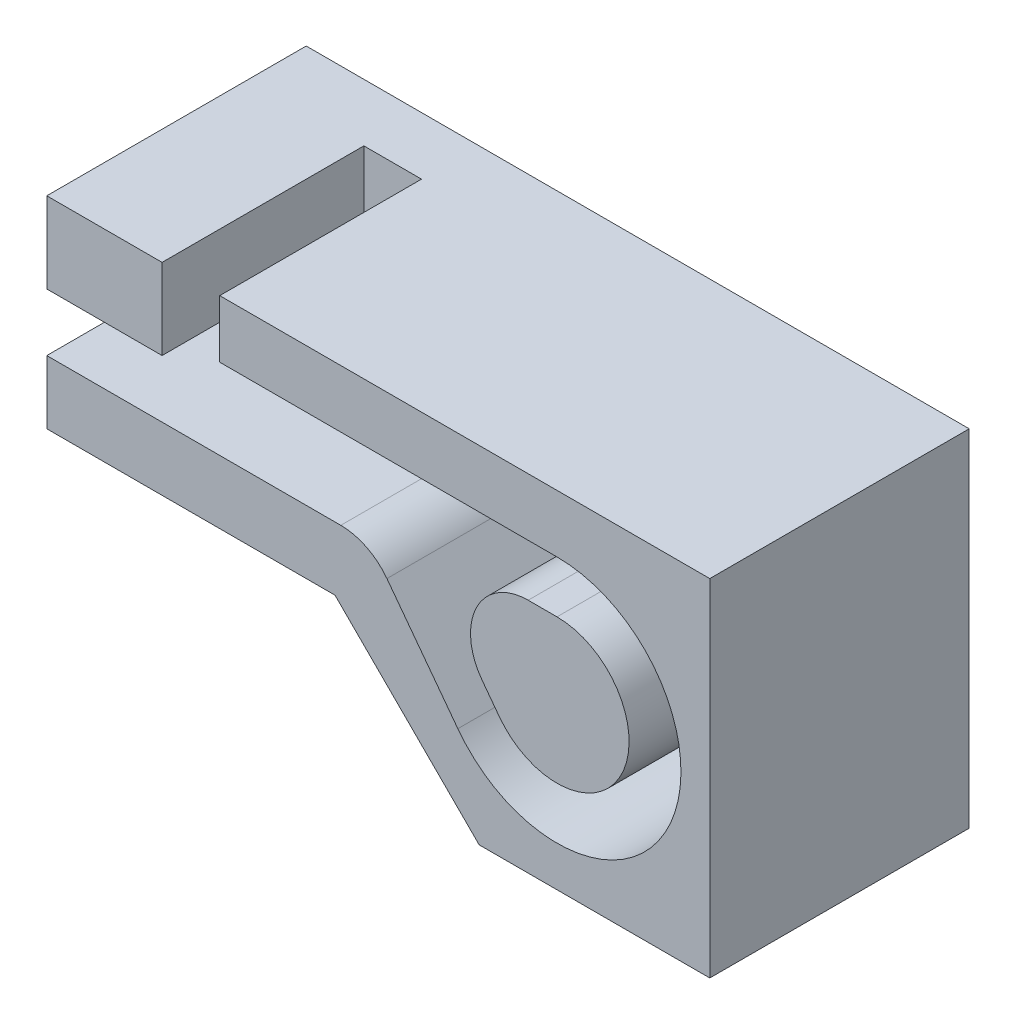
ISO-10303-21;
HEADER;
FILE_DESCRIPTION(('STEP AP214'),'2;1');
FILE_NAME('part.step','',(''),(''),'','','');
FILE_SCHEMA(('AUTOMOTIVE_DESIGN { 1 0 10303 214 1 1 1 1 }'));
ENDSEC;
DATA;
#1=APPLICATION_CONTEXT('core data for automotive mechanical design processes');
#2=APPLICATION_PROTOCOL_DEFINITION('international standard','automotive_design',2000,#1);
#3=PRODUCT_CONTEXT('',#1,'mechanical');
#4=PRODUCT('Part','Part','',(#3));
#5=PRODUCT_RELATED_PRODUCT_CATEGORY('part','',(#4));
#6=PRODUCT_DEFINITION_FORMATION('','',#4);
#7=PRODUCT_DEFINITION_CONTEXT('part definition',#1,'design');
#8=PRODUCT_DEFINITION('design','',#6,#7);
#9=PRODUCT_DEFINITION_SHAPE('','',#8);
#10=(LENGTH_UNIT() NAMED_UNIT(*) SI_UNIT(.MILLI.,.METRE.));
#11=(NAMED_UNIT(*) PLANE_ANGLE_UNIT() SI_UNIT($,.RADIAN.));
#12=(NAMED_UNIT(*) SI_UNIT($,.STERADIAN.) SOLID_ANGLE_UNIT());
#13=UNCERTAINTY_MEASURE_WITH_UNIT(LENGTH_MEASURE(1.E-05),#10,'distance_accuracy_value','');
#14=(GEOMETRIC_REPRESENTATION_CONTEXT(3) GLOBAL_UNCERTAINTY_ASSIGNED_CONTEXT((#13)) GLOBAL_UNIT_ASSIGNED_CONTEXT((#10,
#11,#12)) REPRESENTATION_CONTEXT('',''));
#15=CARTESIAN_POINT('',(0.,0.,0.));
#16=DIRECTION('',(0.,0.,1.));
#17=DIRECTION('',(1.,0.,0.));
#18=AXIS2_PLACEMENT_3D('',#15,#16,#17);
#19=CARTESIAN_POINT('',(0.,0.,2.));
#20=DIRECTION('',(0.,1.,0.));
#21=DIRECTION('',(-1.,0.,0.));
#22=AXIS2_PLACEMENT_3D('',#19,#20,#21);
#23=PLANE('',#22);
#24=DIRECTION('',(1.,0.,0.));
#25=VECTOR('',#24,1.);
#26=CARTESIAN_POINT('',(0.,0.,0.));
#27=LINE('',#26,#25);
#28=CARTESIAN_POINT('',(-10.,0.,0.));
#29=VERTEX_POINT('',#28);
#30=CARTESIAN_POINT('',(0.,0.,0.));
#31=VERTEX_POINT('',#30);
#32=EDGE_CURVE('E396',#29,#31,#27,.T.);
#33=ORIENTED_EDGE('',*,*,#32,.T.);
#34=DIRECTION('',(0.,0.,-1.));
#35=VECTOR('',#34,1.);
#36=CARTESIAN_POINT('',(0.,0.,2.));
#37=LINE('',#36,#35);
#38=CARTESIAN_POINT('',(0.,0.,9.));
#39=VERTEX_POINT('',#38);
#40=EDGE_CURVE('E12',#39,#31,#37,.T.);
#41=ORIENTED_EDGE('',*,*,#40,.F.);
#42=DIRECTION('',(1.,0.,0.));
#43=VECTOR('',#42,1.);
#44=CARTESIAN_POINT('',(0.,0.,9.));
#45=LINE('',#44,#43);
#46=CARTESIAN_POINT('',(-10.,0.,9.));
#47=VERTEX_POINT('',#46);
#48=EDGE_CURVE('E311',#47,#39,#45,.T.);
#49=ORIENTED_EDGE('',*,*,#48,.F.);
#50=DIRECTION('',(0.,0.,-1.));
#51=VECTOR('',#50,1.);
#52=CARTESIAN_POINT('',(-10.,0.,2.));
#53=LINE('',#52,#51);
#54=EDGE_CURVE('E401',#47,#29,#53,.T.);
#55=ORIENTED_EDGE('',*,*,#54,.T.);
#56=EDGE_LOOP('',(#33,#41,#49,#55));
#57=FACE_BOUND('',#56,.T.);
#58=ADVANCED_FACE('F131',(#57),#23,.F.);
#59=CARTESIAN_POINT('',(5.,-5.,2.));
#60=DIRECTION('',(0.707106781186547,0.707106781186548,0.));
#61=DIRECTION('',(-0.707106781186548,0.707106781186547,0.));
#62=AXIS2_PLACEMENT_3D('',#59,#60,#61);
#63=PLANE('',#62);
#64=DIRECTION('',(0.707106781186548,-0.707106781186547,0.));
#65=VECTOR('',#64,1.);
#66=CARTESIAN_POINT('',(5.,-5.,0.));
#67=LINE('',#66,#65);
#68=CARTESIAN_POINT('',(5.,-5.,0.));
#69=VERTEX_POINT('',#68);
#70=EDGE_CURVE('E404',#31,#69,#67,.T.);
#71=ORIENTED_EDGE('',*,*,#70,.T.);
#72=DIRECTION('',(0.,0.,-1.));
#73=VECTOR('',#72,1.);
#74=CARTESIAN_POINT('',(5.,-5.,2.));
#75=LINE('',#74,#73);
#76=CARTESIAN_POINT('',(5.,-5.,9.));
#77=VERTEX_POINT('',#76);
#78=EDGE_CURVE('E138',#77,#69,#75,.T.);
#79=ORIENTED_EDGE('',*,*,#78,.F.);
#80=DIRECTION('',(0.707106781186548,-0.707106781186547,0.));
#81=VECTOR('',#80,1.);
#82=CARTESIAN_POINT('',(0.,0.,9.));
#83=LINE('',#82,#81);
#84=EDGE_CURVE('E314',#39,#77,#83,.T.);
#85=ORIENTED_EDGE('',*,*,#84,.F.);
#86=ORIENTED_EDGE('',*,*,#40,.T.);
#87=EDGE_LOOP('',(#71,#79,#85,#86));
#88=FACE_BOUND('',#87,.T.);
#89=ADVANCED_FACE('F449',(#88),#63,.F.);
#90=CARTESIAN_POINT('',(13.,-5.,2.));
#91=DIRECTION('',(0.,1.,0.));
#92=DIRECTION('',(0.,0.,1.));
#93=AXIS2_PLACEMENT_3D('',#90,#91,#92);
#94=PLANE('',#93);
#95=DIRECTION('',(1.,0.,0.));
#96=VECTOR('',#95,1.);
#97=CARTESIAN_POINT('',(13.,-5.,0.));
#98=LINE('',#97,#96);
#99=CARTESIAN_POINT('',(13.,-5.,0.));
#100=VERTEX_POINT('',#99);
#101=EDGE_CURVE('E406',#69,#100,#98,.T.);
#102=ORIENTED_EDGE('',*,*,#101,.T.);
#103=DIRECTION('',(0.,0.,-1.));
#104=VECTOR('',#103,1.);
#105=CARTESIAN_POINT('',(13.,-5.,2.));
#106=LINE('',#105,#104);
#107=CARTESIAN_POINT('',(13.,-5.,9.));
#108=VERTEX_POINT('',#107);
#109=EDGE_CURVE('E421',#108,#100,#106,.T.);
#110=ORIENTED_EDGE('',*,*,#109,.F.);
#111=DIRECTION('',(1.,0.,0.));
#112=VECTOR('',#111,1.);
#113=CARTESIAN_POINT('',(0.,-5.,9.));
#114=LINE('',#113,#112);
#115=EDGE_CURVE('E317',#77,#108,#114,.T.);
#116=ORIENTED_EDGE('',*,*,#115,.F.);
#117=ORIENTED_EDGE('',*,*,#78,.T.);
#118=EDGE_LOOP('',(#102,#110,#116,#117));
#119=FACE_BOUND('',#118,.T.);
#120=ADVANCED_FACE('F427',(#119),#94,.F.);
#121=CARTESIAN_POINT('',(13.,7.,2.));
#122=DIRECTION('',(-1.,0.,0.));
#123=DIRECTION('',(0.,-1.,0.));
#124=AXIS2_PLACEMENT_3D('',#121,#122,#123);
#125=PLANE('',#124);
#126=DIRECTION('',(0.,1.,0.));
#127=VECTOR('',#126,1.);
#128=CARTESIAN_POINT('',(13.,7.,0.));
#129=LINE('',#128,#127);
#130=CARTESIAN_POINT('',(13.,7.,0.));
#131=VERTEX_POINT('',#130);
#132=EDGE_CURVE('E408',#100,#131,#129,.T.);
#133=ORIENTED_EDGE('',*,*,#132,.T.);
#134=DIRECTION('',(0.,0.,-1.));
#135=VECTOR('',#134,1.);
#136=CARTESIAN_POINT('',(13.,7.,2.));
#137=LINE('',#136,#135);
#138=CARTESIAN_POINT('',(13.,7.,9.));
#139=VERTEX_POINT('',#138);
#140=EDGE_CURVE('E418',#139,#131,#137,.T.);
#141=ORIENTED_EDGE('',*,*,#140,.F.);
#142=DIRECTION('',(0.,1.,0.));
#143=VECTOR('',#142,1.);
#144=CARTESIAN_POINT('',(13.,0.,9.));
#145=LINE('',#144,#143);
#146=EDGE_CURVE('E320',#108,#139,#145,.T.);
#147=ORIENTED_EDGE('',*,*,#146,.F.);
#148=ORIENTED_EDGE('',*,*,#109,.T.);
#149=EDGE_LOOP('',(#133,#141,#147,#148));
#150=FACE_BOUND('',#149,.T.);
#151=ADVANCED_FACE('F437',(#150),#125,.F.);
#152=CARTESIAN_POINT('',(-10.,7.,2.));
#153=DIRECTION('',(0.,-1.,0.));
#154=DIRECTION('',(0.,0.,-1.));
#155=AXIS2_PLACEMENT_3D('',#152,#153,#154);
#156=PLANE('',#155);
#157=DIRECTION('',(-1.,0.,0.));
#158=VECTOR('',#157,1.);
#159=CARTESIAN_POINT('',(-10.,7.,0.));
#160=LINE('',#159,#158);
#161=CARTESIAN_POINT('',(-10.,7.,0.));
#162=VERTEX_POINT('',#161);
#163=EDGE_CURVE('E410',#131,#162,#160,.T.);
#164=ORIENTED_EDGE('',*,*,#163,.T.);
#165=DIRECTION('',(0.,0.,-1.));
#166=VECTOR('',#165,1.);
#167=CARTESIAN_POINT('',(-10.,7.,2.));
#168=LINE('',#167,#166);
#169=CARTESIAN_POINT('',(-10.,7.,9.));
#170=VERTEX_POINT('',#169);
#171=EDGE_CURVE('E415',#170,#162,#168,.T.);
#172=ORIENTED_EDGE('',*,*,#171,.F.);
#173=DIRECTION('',(-1.,0.,0.));
#174=VECTOR('',#173,1.);
#175=CARTESIAN_POINT('',(0.,7.,9.));
#176=LINE('',#175,#174);
#177=CARTESIAN_POINT('',(-6.,7.,9.));
#178=VERTEX_POINT('',#177);
#179=EDGE_CURVE('E290',#178,#170,#176,.T.);
#180=ORIENTED_EDGE('',*,*,#179,.F.);
#181=DIRECTION('',(0.,0.,-1.));
#182=VECTOR('',#181,1.);
#183=CARTESIAN_POINT('',(-6.,7.,9.));
#184=LINE('',#183,#182);
#185=CARTESIAN_POINT('',(-6.,7.,2.));
#186=VERTEX_POINT('',#185);
#187=EDGE_CURVE('E277',#178,#186,#184,.T.);
#188=ORIENTED_EDGE('',*,*,#187,.T.);
#189=DIRECTION('',(-1.,0.,0.));
#190=VECTOR('',#189,1.);
#191=CARTESIAN_POINT('',(-10.,7.,2.));
#192=LINE('',#191,#190);
#193=CARTESIAN_POINT('',(-4.,7.,2.));
#194=VERTEX_POINT('',#193);
#195=EDGE_CURVE('E150',#194,#186,#192,.T.);
#196=ORIENTED_EDGE('',*,*,#195,.F.);
#197=DIRECTION('',(0.,0.,-1.));
#198=VECTOR('',#197,1.);
#199=CARTESIAN_POINT('',(-4.,7.,9.));
#200=LINE('',#199,#198);
#201=CARTESIAN_POINT('',(-4.,7.,9.));
#202=VERTEX_POINT('',#201);
#203=EDGE_CURVE('E353',#202,#194,#200,.T.);
#204=ORIENTED_EDGE('',*,*,#203,.F.);
#205=DIRECTION('',(-1.,0.,0.));
#206=VECTOR('',#205,1.);
#207=CARTESIAN_POINT('',(0.,7.,9.));
#208=LINE('',#207,#206);
#209=EDGE_CURVE('E323',#139,#202,#208,.T.);
#210=ORIENTED_EDGE('',*,*,#209,.F.);
#211=ORIENTED_EDGE('',*,*,#140,.T.);
#212=EDGE_LOOP('',(#164,#172,#180,#188,#196,#204,#210,#211));
#213=FACE_BOUND('',#212,.T.);
#214=ADVANCED_FACE('F441',(#213),#156,.F.);
#215=CARTESIAN_POINT('',(-10.,0.,2.));
#216=DIRECTION('',(1.,0.,0.));
#217=DIRECTION('',(0.,0.,-1.));
#218=AXIS2_PLACEMENT_3D('',#215,#216,#217);
#219=PLANE('',#218);
#220=DIRECTION('',(0.,-1.,0.));
#221=VECTOR('',#220,1.);
#222=CARTESIAN_POINT('',(-10.,0.,0.));
#223=LINE('',#222,#221);
#224=EDGE_CURVE('E399',#162,#29,#223,.T.);
#225=ORIENTED_EDGE('',*,*,#224,.T.);
#226=ORIENTED_EDGE('',*,*,#54,.F.);
#227=DIRECTION('',(0.,-1.,0.));
#228=VECTOR('',#227,1.);
#229=CARTESIAN_POINT('',(-10.,0.,9.));
#230=LINE('',#229,#228);
#231=CARTESIAN_POINT('',(-10.,2.2,9.));
#232=VERTEX_POINT('',#231);
#233=EDGE_CURVE('E308',#232,#47,#230,.T.);
#234=ORIENTED_EDGE('',*,*,#233,.F.);
#235=DIRECTION('',(0.,0.,-1.));
#236=VECTOR('',#235,1.);
#237=CARTESIAN_POINT('',(-10.,2.2,9.));
#238=LINE('',#237,#236);
#239=CARTESIAN_POINT('',(-10.,2.2,2.));
#240=VERTEX_POINT('',#239);
#241=EDGE_CURVE('E355',#232,#240,#238,.T.);
#242=ORIENTED_EDGE('',*,*,#241,.T.);
#243=DIRECTION('',(0.,-1.,0.));
#244=VECTOR('',#243,1.);
#245=CARTESIAN_POINT('',(-10.,0.,2.));
#246=LINE('',#245,#244);
#247=CARTESIAN_POINT('',(-10.,4.2,2.));
#248=VERTEX_POINT('',#247);
#249=EDGE_CURVE('E398',#248,#240,#246,.T.);
#250=ORIENTED_EDGE('',*,*,#249,.F.);
#251=DIRECTION('',(0.,0.,-1.));
#252=VECTOR('',#251,1.);
#253=CARTESIAN_POINT('',(-10.,4.2,9.));
#254=LINE('',#253,#252);
#255=CARTESIAN_POINT('',(-10.,4.2,9.));
#256=VERTEX_POINT('',#255);
#257=EDGE_CURVE('E295',#256,#248,#254,.T.);
#258=ORIENTED_EDGE('',*,*,#257,.F.);
#259=DIRECTION('',(0.,-1.,0.));
#260=VECTOR('',#259,1.);
#261=CARTESIAN_POINT('',(-10.,0.,9.));
#262=LINE('',#261,#260);
#263=EDGE_CURVE('E285',#170,#256,#262,.T.);
#264=ORIENTED_EDGE('',*,*,#263,.F.);
#265=ORIENTED_EDGE('',*,*,#171,.T.);
#266=EDGE_LOOP('',(#225,#226,#234,#242,#250,#258,#264,#265));
#267=FACE_BOUND('',#266,.T.);
#268=ADVANCED_FACE('F452',(#267),#219,.F.);
#269=CARTESIAN_POINT('',(0.,0.,2.));
#270=DIRECTION('',(0.,0.,-1.));
#271=DIRECTION('',(-1.,0.,0.));
#272=AXIS2_PLACEMENT_3D('',#269,#270,#271);
#273=PLANE('',#272);
#274=DIRECTION('',(0.,-1.,0.));
#275=VECTOR('',#274,1.);
#276=CARTESIAN_POINT('',(-6.,0.,2.));
#277=LINE('',#276,#275);
#278=CARTESIAN_POINT('',(-6.,4.2,2.));
#279=VERTEX_POINT('',#278);
#280=EDGE_CURVE('E145',#186,#279,#277,.T.);
#281=ORIENTED_EDGE('',*,*,#280,.T.);
#282=DIRECTION('',(-1.,0.,0.));
#283=VECTOR('',#282,1.);
#284=CARTESIAN_POINT('',(0.,4.2,2.));
#285=LINE('',#284,#283);
#286=EDGE_CURVE('E273',#279,#248,#285,.T.);
#287=ORIENTED_EDGE('',*,*,#286,.T.);
#288=ORIENTED_EDGE('',*,*,#249,.T.);
#289=DIRECTION('',(-1.,0.,0.));
#290=VECTOR('',#289,1.);
#291=CARTESIAN_POINT('',(0.,2.2,2.));
#292=LINE('',#291,#290);
#293=CARTESIAN_POINT('',(0.200000000000002,2.2,2.));
#294=VERTEX_POINT('',#293);
#295=EDGE_CURVE('E337',#294,#240,#292,.T.);
#296=ORIENTED_EDGE('',*,*,#295,.F.);
#297=CARTESIAN_POINT('',(0.200000000000003,0.199999999999999,2.));
#298=DIRECTION('',(0.,0.,1.));
#299=DIRECTION('',(1.,0.,0.));
#300=AXIS2_PLACEMENT_3D('',#297,#298,#299);
#301=CIRCLE('',#300,2.);
#302=CARTESIAN_POINT('',(1.8,1.4,2.));
#303=VERTEX_POINT('',#302);
#304=EDGE_CURVE('E335',#303,#294,#301,.T.);
#305=ORIENTED_EDGE('',*,*,#304,.F.);
#306=DIRECTION('',(0.6,-0.8,0.));
#307=VECTOR('',#306,1.);
#308=CARTESIAN_POINT('',(1.824,1.368,2.));
#309=LINE('',#308,#307);
#310=CARTESIAN_POINT('',(4.26,-1.88,2.));
#311=VERTEX_POINT('',#310);
#312=EDGE_CURVE('E276',#303,#311,#309,.T.);
#313=ORIENTED_EDGE('',*,*,#312,.T.);
#314=CARTESIAN_POINT('',(7.7,0.699999999999999,2.));
#315=DIRECTION('',(0.,0.,1.));
#316=DIRECTION('',(1.,0.,0.));
#317=AXIS2_PLACEMENT_3D('',#314,#315,#316);
#318=CIRCLE('',#317,4.3);
#319=CARTESIAN_POINT('',(7.7,5.,2.));
#320=VERTEX_POINT('',#319);
#321=EDGE_CURVE('E304',#311,#320,#318,.T.);
#322=ORIENTED_EDGE('',*,*,#321,.T.);
#323=DIRECTION('',(1.,0.,0.));
#324=VECTOR('',#323,1.);
#325=CARTESIAN_POINT('',(0.,5.,2.));
#326=LINE('',#325,#324);
#327=CARTESIAN_POINT('',(-4.,5.,2.));
#328=VERTEX_POINT('',#327);
#329=EDGE_CURVE('E342',#328,#320,#326,.T.);
#330=ORIENTED_EDGE('',*,*,#329,.F.);
#331=DIRECTION('',(0.,-1.,0.));
#332=VECTOR('',#331,1.);
#333=CARTESIAN_POINT('',(-4.,0.,2.));
#334=LINE('',#333,#332);
#335=EDGE_CURVE('E340',#194,#328,#334,.T.);
#336=ORIENTED_EDGE('',*,*,#335,.F.);
#337=ORIENTED_EDGE('',*,*,#195,.T.);
#338=EDGE_LOOP('',(#281,#287,#288,#296,#305,#313,#322,#330,#336,#337));
#339=FACE_BOUND('',#338,.T.);
#340=DIRECTION('',(0.6,-0.8,0.));
#341=VECTOR('',#340,1.);
#342=CARTESIAN_POINT('',(3.264,2.448,2.));
#343=LINE('',#342,#341);
#344=CARTESIAN_POINT('',(5.1,0.,2.));
#345=VERTEX_POINT('',#344);
#346=CARTESIAN_POINT('',(5.7,-0.8,2.));
#347=VERTEX_POINT('',#346);
#348=EDGE_CURVE('E363',#345,#347,#343,.T.);
#349=ORIENTED_EDGE('',*,*,#348,.F.);
#350=CARTESIAN_POINT('',(6.7,1.2,2.));
#351=DIRECTION('',(0.,0.,1.));
#352=DIRECTION('',(1.,0.,0.));
#353=AXIS2_PLACEMENT_3D('',#350,#351,#352);
#354=CIRCLE('',#353,2.);
#355=CARTESIAN_POINT('',(6.7,3.2,2.));
#356=VERTEX_POINT('',#355);
#357=EDGE_CURVE('E368',#356,#345,#354,.T.);
#358=ORIENTED_EDGE('',*,*,#357,.F.);
#359=DIRECTION('',(1.,0.,0.));
#360=VECTOR('',#359,1.);
#361=CARTESIAN_POINT('',(0.,3.2,2.));
#362=LINE('',#361,#360);
#363=CARTESIAN_POINT('',(7.7,3.2,2.));
#364=VERTEX_POINT('',#363);
#365=EDGE_CURVE('E381',#356,#364,#362,.T.);
#366=ORIENTED_EDGE('',*,*,#365,.T.);
#367=CARTESIAN_POINT('',(7.7,0.699999999999999,2.));
#368=DIRECTION('',(0.,0.,1.));
#369=DIRECTION('',(1.,0.,0.));
#370=AXIS2_PLACEMENT_3D('',#367,#368,#369);
#371=CIRCLE('',#370,2.5);
#372=EDGE_CURVE('E378',#347,#364,#371,.T.);
#373=ORIENTED_EDGE('',*,*,#372,.F.);
#374=EDGE_LOOP('',(#349,#358,#366,#373));
#375=FACE_BOUND('',#374,.T.);
#376=ADVANCED_FACE('F456',(#339,#375),#273,.F.);
#377=CARTESIAN_POINT('',(0.,0.,0.));
#378=DIRECTION('',(0.,0.,-1.));
#379=DIRECTION('',(-1.,0.,0.));
#380=AXIS2_PLACEMENT_3D('',#377,#378,#379);
#381=PLANE('',#380);
#382=ORIENTED_EDGE('',*,*,#32,.F.);
#383=ORIENTED_EDGE('',*,*,#224,.F.);
#384=ORIENTED_EDGE('',*,*,#163,.F.);
#385=ORIENTED_EDGE('',*,*,#132,.F.);
#386=ORIENTED_EDGE('',*,*,#101,.F.);
#387=ORIENTED_EDGE('',*,*,#70,.F.);
#388=EDGE_LOOP('',(#382,#383,#384,#385,#386,#387));
#389=FACE_BOUND('',#388,.T.);
#390=ADVANCED_FACE('F433',(#389),#381,.T.);
#391=CARTESIAN_POINT('',(3.264,2.448,9.));
#392=DIRECTION('',(0.8,0.6,0.));
#393=DIRECTION('',(-0.6,0.8,0.));
#394=AXIS2_PLACEMENT_3D('',#391,#392,#393);
#395=PLANE('',#394);
#396=ORIENTED_EDGE('',*,*,#348,.T.);
#397=DIRECTION('',(0.,0.,-1.));
#398=VECTOR('',#397,1.);
#399=CARTESIAN_POINT('',(5.7,-0.8,9.));
#400=LINE('',#399,#398);
#401=CARTESIAN_POINT('',(5.7,-0.8,9.));
#402=VERTEX_POINT('',#401);
#403=EDGE_CURVE('E393',#402,#347,#400,.T.);
#404=ORIENTED_EDGE('',*,*,#403,.F.);
#405=DIRECTION('',(0.6,-0.8,0.));
#406=VECTOR('',#405,1.);
#407=CARTESIAN_POINT('',(3.264,2.448,9.));
#408=LINE('',#407,#406);
#409=CARTESIAN_POINT('',(5.1,0.,9.));
#410=VERTEX_POINT('',#409);
#411=EDGE_CURVE('E364',#410,#402,#408,.T.);
#412=ORIENTED_EDGE('',*,*,#411,.F.);
#413=DIRECTION('',(0.,0.,-1.));
#414=VECTOR('',#413,1.);
#415=CARTESIAN_POINT('',(5.1,0.,9.));
#416=LINE('',#415,#414);
#417=EDGE_CURVE('E375',#410,#345,#416,.T.);
#418=ORIENTED_EDGE('',*,*,#417,.T.);
#419=EDGE_LOOP('',(#396,#404,#412,#418));
#420=FACE_BOUND('',#419,.T.);
#421=ADVANCED_FACE('F468',(#420),#395,.F.);
#422=CARTESIAN_POINT('',(7.7,0.699999999999999,9.));
#423=DIRECTION('',(0.,0.,-1.));
#424=DIRECTION('',(-1.,0.,0.));
#425=AXIS2_PLACEMENT_3D('',#422,#423,#424);
#426=CYLINDRICAL_SURFACE('',#425,2.5);
#427=ORIENTED_EDGE('',*,*,#372,.T.);
#428=DIRECTION('',(0.,0.,-1.));
#429=VECTOR('',#428,1.);
#430=CARTESIAN_POINT('',(7.7,3.2,9.));
#431=LINE('',#430,#429);
#432=CARTESIAN_POINT('',(7.7,3.2,9.));
#433=VERTEX_POINT('',#432);
#434=EDGE_CURVE('E390',#433,#364,#431,.T.);
#435=ORIENTED_EDGE('',*,*,#434,.F.);
#436=CARTESIAN_POINT('',(7.7,0.699999999999999,9.));
#437=DIRECTION('',(0.,0.,1.));
#438=DIRECTION('',(1.,0.,0.));
#439=AXIS2_PLACEMENT_3D('',#436,#437,#438);
#440=CIRCLE('',#439,2.5);
#441=EDGE_CURVE('E367',#402,#433,#440,.T.);
#442=ORIENTED_EDGE('',*,*,#441,.F.);
#443=ORIENTED_EDGE('',*,*,#403,.T.);
#444=EDGE_LOOP('',(#427,#435,#442,#443));
#445=FACE_BOUND('',#444,.T.);
#446=ADVANCED_FACE('F476',(#445),#426,.T.);
#447=CARTESIAN_POINT('',(0.,3.2,9.));
#448=DIRECTION('',(0.,1.,0.));
#449=DIRECTION('',(0.,0.,1.));
#450=AXIS2_PLACEMENT_3D('',#447,#448,#449);
#451=PLANE('',#450);
#452=ORIENTED_EDGE('',*,*,#365,.F.);
#453=DIRECTION('',(0.,0.,-1.));
#454=VECTOR('',#453,1.);
#455=CARTESIAN_POINT('',(6.7,3.2,9.));
#456=LINE('',#455,#454);
#457=CARTESIAN_POINT('',(6.7,3.2,9.));
#458=VERTEX_POINT('',#457);
#459=EDGE_CURVE('E387',#458,#356,#456,.T.);
#460=ORIENTED_EDGE('',*,*,#459,.F.);
#461=DIRECTION('',(1.,0.,0.));
#462=VECTOR('',#461,1.);
#463=CARTESIAN_POINT('',(0.,3.2,9.));
#464=LINE('',#463,#462);
#465=EDGE_CURVE('E370',#458,#433,#464,.T.);
#466=ORIENTED_EDGE('',*,*,#465,.T.);
#467=ORIENTED_EDGE('',*,*,#434,.T.);
#468=EDGE_LOOP('',(#452,#460,#466,#467));
#469=FACE_BOUND('',#468,.T.);
#470=ADVANCED_FACE('F474',(#469),#451,.T.);
#471=CARTESIAN_POINT('',(6.7,1.2,9.));
#472=DIRECTION('',(0.,0.,-1.));
#473=DIRECTION('',(-1.,0.,0.));
#474=AXIS2_PLACEMENT_3D('',#471,#472,#473);
#475=CYLINDRICAL_SURFACE('',#474,2.);
#476=ORIENTED_EDGE('',*,*,#357,.T.);
#477=ORIENTED_EDGE('',*,*,#417,.F.);
#478=CARTESIAN_POINT('',(6.7,1.2,9.));
#479=DIRECTION('',(0.,0.,1.));
#480=DIRECTION('',(1.,0.,0.));
#481=AXIS2_PLACEMENT_3D('',#478,#479,#480);
#482=CIRCLE('',#481,2.);
#483=EDGE_CURVE('E373',#458,#410,#482,.T.);
#484=ORIENTED_EDGE('',*,*,#483,.F.);
#485=ORIENTED_EDGE('',*,*,#459,.T.);
#486=EDGE_LOOP('',(#476,#477,#484,#485));
#487=FACE_BOUND('',#486,.T.);
#488=ADVANCED_FACE('F464',(#487),#475,.T.);
#489=CARTESIAN_POINT('',(0.,0.,9.));
#490=DIRECTION('',(0.,0.,1.));
#491=DIRECTION('',(1.,0.,0.));
#492=AXIS2_PLACEMENT_3D('',#489,#490,#491);
#493=PLANE('',#492);
#494=ORIENTED_EDGE('',*,*,#411,.T.);
#495=ORIENTED_EDGE('',*,*,#441,.T.);
#496=ORIENTED_EDGE('',*,*,#465,.F.);
#497=ORIENTED_EDGE('',*,*,#483,.T.);
#498=EDGE_LOOP('',(#494,#495,#496,#497));
#499=FACE_BOUND('',#498,.T.);
#500=ADVANCED_FACE('F470',(#499),#493,.T.);
#501=CARTESIAN_POINT('',(1.824,1.368,9.));
#502=DIRECTION('',(0.8,0.6,0.));
#503=DIRECTION('',(-0.6,0.8,0.));
#504=AXIS2_PLACEMENT_3D('',#501,#502,#503);
#505=PLANE('',#504);
#506=ORIENTED_EDGE('',*,*,#312,.F.);
#507=DIRECTION('',(0.,0.,-1.));
#508=VECTOR('',#507,1.);
#509=CARTESIAN_POINT('',(1.8,1.4,9.));
#510=LINE('',#509,#508);
#511=CARTESIAN_POINT('',(1.8,1.4,9.));
#512=VERTEX_POINT('',#511);
#513=EDGE_CURVE('E361',#512,#303,#510,.T.);
#514=ORIENTED_EDGE('',*,*,#513,.F.);
#515=DIRECTION('',(0.6,-0.8,0.));
#516=VECTOR('',#515,1.);
#517=CARTESIAN_POINT('',(1.824,1.368,9.));
#518=LINE('',#517,#516);
#519=CARTESIAN_POINT('',(4.26,-1.88,9.));
#520=VERTEX_POINT('',#519);
#521=EDGE_CURVE('E300',#512,#520,#518,.T.);
#522=ORIENTED_EDGE('',*,*,#521,.T.);
#523=DIRECTION('',(0.,0.,-1.));
#524=VECTOR('',#523,1.);
#525=CARTESIAN_POINT('',(4.26,-1.88,9.));
#526=LINE('',#525,#524);
#527=EDGE_CURVE('E332',#520,#311,#526,.T.);
#528=ORIENTED_EDGE('',*,*,#527,.T.);
#529=EDGE_LOOP('',(#506,#514,#522,#528));
#530=FACE_BOUND('',#529,.T.);
#531=ADVANCED_FACE('F540',(#530),#505,.T.);
#532=CARTESIAN_POINT('',(0.200000000000003,0.199999999999999,9.));
#533=DIRECTION('',(0.,0.,-1.));
#534=DIRECTION('',(-1.,0.,0.));
#535=AXIS2_PLACEMENT_3D('',#532,#533,#534);
#536=CYLINDRICAL_SURFACE('',#535,2.);
#537=ORIENTED_EDGE('',*,*,#304,.T.);
#538=DIRECTION('',(0.,0.,-1.));
#539=VECTOR('',#538,1.);
#540=CARTESIAN_POINT('',(0.200000000000002,2.2,9.));
#541=LINE('',#540,#539);
#542=CARTESIAN_POINT('',(0.200000000000002,2.2,9.));
#543=VERTEX_POINT('',#542);
#544=EDGE_CURVE('E358',#543,#294,#541,.T.);
#545=ORIENTED_EDGE('',*,*,#544,.F.);
#546=CARTESIAN_POINT('',(0.200000000000003,0.199999999999999,9.));
#547=DIRECTION('',(0.,0.,1.));
#548=DIRECTION('',(1.,0.,0.));
#549=AXIS2_PLACEMENT_3D('',#546,#547,#548);
#550=CIRCLE('',#549,2.);
#551=EDGE_CURVE('E303',#512,#543,#550,.T.);
#552=ORIENTED_EDGE('',*,*,#551,.F.);
#553=ORIENTED_EDGE('',*,*,#513,.T.);
#554=EDGE_LOOP('',(#537,#545,#552,#553));
#555=FACE_BOUND('',#554,.T.);
#556=ADVANCED_FACE('F549',(#555),#536,.T.);
#557=CARTESIAN_POINT('',(0.,2.2,9.));
#558=DIRECTION('',(0.,-1.,0.));
#559=DIRECTION('',(1.,0.,0.));
#560=AXIS2_PLACEMENT_3D('',#557,#558,#559);
#561=PLANE('',#560);
#562=ORIENTED_EDGE('',*,*,#295,.T.);
#563=ORIENTED_EDGE('',*,*,#241,.F.);
#564=DIRECTION('',(-1.,0.,0.));
#565=VECTOR('',#564,1.);
#566=CARTESIAN_POINT('',(0.,2.2,9.));
#567=LINE('',#566,#565);
#568=EDGE_CURVE('E306',#543,#232,#567,.T.);
#569=ORIENTED_EDGE('',*,*,#568,.F.);
#570=ORIENTED_EDGE('',*,*,#544,.T.);
#571=EDGE_LOOP('',(#562,#563,#569,#570));
#572=FACE_BOUND('',#571,.T.);
#573=ADVANCED_FACE('F559',(#572),#561,.F.);
#574=CARTESIAN_POINT('',(-4.,0.,9.));
#575=DIRECTION('',(1.,0.,0.));
#576=DIRECTION('',(0.,1.,0.));
#577=AXIS2_PLACEMENT_3D('',#574,#575,#576);
#578=PLANE('',#577);
#579=ORIENTED_EDGE('',*,*,#335,.T.);
#580=DIRECTION('',(0.,0.,-1.));
#581=VECTOR('',#580,1.);
#582=CARTESIAN_POINT('',(-4.,5.,9.));
#583=LINE('',#582,#581);
#584=CARTESIAN_POINT('',(-4.,5.,9.));
#585=VERTEX_POINT('',#584);
#586=EDGE_CURVE('E350',#585,#328,#583,.T.);
#587=ORIENTED_EDGE('',*,*,#586,.F.);
#588=DIRECTION('',(0.,-1.,0.));
#589=VECTOR('',#588,1.);
#590=CARTESIAN_POINT('',(-4.,0.,9.));
#591=LINE('',#590,#589);
#592=EDGE_CURVE('E325',#202,#585,#591,.T.);
#593=ORIENTED_EDGE('',*,*,#592,.F.);
#594=ORIENTED_EDGE('',*,*,#203,.T.);
#595=EDGE_LOOP('',(#579,#587,#593,#594));
#596=FACE_BOUND('',#595,.T.);
#597=ADVANCED_FACE('F569',(#596),#578,.F.);
#598=CARTESIAN_POINT('',(0.,5.,9.));
#599=DIRECTION('',(0.,1.,0.));
#600=DIRECTION('',(0.,0.,1.));
#601=AXIS2_PLACEMENT_3D('',#598,#599,#600);
#602=PLANE('',#601);
#603=ORIENTED_EDGE('',*,*,#329,.T.);
#604=DIRECTION('',(0.,0.,-1.));
#605=VECTOR('',#604,1.);
#606=CARTESIAN_POINT('',(7.7,5.,9.));
#607=LINE('',#606,#605);
#608=CARTESIAN_POINT('',(7.7,5.,9.));
#609=VERTEX_POINT('',#608);
#610=EDGE_CURVE('E347',#609,#320,#607,.T.);
#611=ORIENTED_EDGE('',*,*,#610,.F.);
#612=DIRECTION('',(1.,0.,0.));
#613=VECTOR('',#612,1.);
#614=CARTESIAN_POINT('',(0.,5.,9.));
#615=LINE('',#614,#613);
#616=EDGE_CURVE('E327',#585,#609,#615,.T.);
#617=ORIENTED_EDGE('',*,*,#616,.F.);
#618=ORIENTED_EDGE('',*,*,#586,.T.);
#619=EDGE_LOOP('',(#603,#611,#617,#618));
#620=FACE_BOUND('',#619,.T.);
#621=ADVANCED_FACE('F579',(#620),#602,.F.);
#622=CARTESIAN_POINT('',(7.7,0.699999999999999,9.));
#623=DIRECTION('',(0.,0.,-1.));
#624=DIRECTION('',(-1.,0.,0.));
#625=AXIS2_PLACEMENT_3D('',#622,#623,#624);
#626=CYLINDRICAL_SURFACE('',#625,4.3);
#627=ORIENTED_EDGE('',*,*,#321,.F.);
#628=ORIENTED_EDGE('',*,*,#527,.F.);
#629=CARTESIAN_POINT('',(7.7,0.699999999999999,9.));
#630=DIRECTION('',(0.,0.,1.));
#631=DIRECTION('',(1.,0.,0.));
#632=AXIS2_PLACEMENT_3D('',#629,#630,#631);
#633=CIRCLE('',#632,4.3);
#634=EDGE_CURVE('E329',#520,#609,#633,.T.);
#635=ORIENTED_EDGE('',*,*,#634,.T.);
#636=ORIENTED_EDGE('',*,*,#610,.T.);
#637=EDGE_LOOP('',(#627,#628,#635,#636));
#638=FACE_BOUND('',#637,.T.);
#639=ADVANCED_FACE('F589',(#638),#626,.F.);
#640=CARTESIAN_POINT('',(0.,0.,9.));
#641=DIRECTION('',(0.,0.,1.));
#642=DIRECTION('',(1.,0.,0.));
#643=AXIS2_PLACEMENT_3D('',#640,#641,#642);
#644=PLANE('',#643);
#645=ORIENTED_EDGE('',*,*,#521,.F.);
#646=ORIENTED_EDGE('',*,*,#551,.T.);
#647=ORIENTED_EDGE('',*,*,#568,.T.);
#648=ORIENTED_EDGE('',*,*,#233,.T.);
#649=ORIENTED_EDGE('',*,*,#48,.T.);
#650=ORIENTED_EDGE('',*,*,#84,.T.);
#651=ORIENTED_EDGE('',*,*,#115,.T.);
#652=ORIENTED_EDGE('',*,*,#146,.T.);
#653=ORIENTED_EDGE('',*,*,#209,.T.);
#654=ORIENTED_EDGE('',*,*,#592,.T.);
#655=ORIENTED_EDGE('',*,*,#616,.T.);
#656=ORIENTED_EDGE('',*,*,#634,.F.);
#657=EDGE_LOOP('',(#645,#646,#647,#648,#649,#650,#651,#652,#653,#654,#655,#656));
#658=FACE_BOUND('',#657,.T.);
#659=ADVANCED_FACE('F446',(#658),#644,.T.);
#660=CARTESIAN_POINT('',(0.,4.2,9.));
#661=DIRECTION('',(0.,-1.,0.));
#662=DIRECTION('',(1.,0.,0.));
#663=AXIS2_PLACEMENT_3D('',#660,#661,#662);
#664=PLANE('',#663);
#665=ORIENTED_EDGE('',*,*,#286,.F.);
#666=DIRECTION('',(0.,0.,-1.));
#667=VECTOR('',#666,1.);
#668=CARTESIAN_POINT('',(-6.,4.2,9.));
#669=LINE('',#668,#667);
#670=CARTESIAN_POINT('',(-6.,4.2,9.));
#671=VERTEX_POINT('',#670);
#672=EDGE_CURVE('E268',#671,#279,#669,.T.);
#673=ORIENTED_EDGE('',*,*,#672,.F.);
#674=DIRECTION('',(-1.,0.,0.));
#675=VECTOR('',#674,1.);
#676=CARTESIAN_POINT('',(0.,4.2,9.));
#677=LINE('',#676,#675);
#678=EDGE_CURVE('E272',#671,#256,#677,.T.);
#679=ORIENTED_EDGE('',*,*,#678,.T.);
#680=ORIENTED_EDGE('',*,*,#257,.T.);
#681=EDGE_LOOP('',(#665,#673,#679,#680));
#682=FACE_BOUND('',#681,.T.);
#683=ADVANCED_FACE('F270',(#682),#664,.T.);
#684=CARTESIAN_POINT('',(-6.,0.,9.));
#685=DIRECTION('',(1.,0.,0.));
#686=DIRECTION('',(0.,0.,-1.));
#687=AXIS2_PLACEMENT_3D('',#684,#685,#686);
#688=PLANE('',#687);
#689=ORIENTED_EDGE('',*,*,#280,.F.);
#690=ORIENTED_EDGE('',*,*,#187,.F.);
#691=DIRECTION('',(0.,-1.,0.));
#692=VECTOR('',#691,1.);
#693=CARTESIAN_POINT('',(-6.,0.,9.));
#694=LINE('',#693,#692);
#695=EDGE_CURVE('E283',#178,#671,#694,.T.);
#696=ORIENTED_EDGE('',*,*,#695,.T.);
#697=ORIENTED_EDGE('',*,*,#672,.T.);
#698=EDGE_LOOP('',(#689,#690,#696,#697));
#699=FACE_BOUND('',#698,.T.);
#700=ADVANCED_FACE('F288',(#699),#688,.T.);
#701=CARTESIAN_POINT('',(0.,0.,9.));
#702=DIRECTION('',(0.,0.,1.));
#703=DIRECTION('',(1.,0.,0.));
#704=AXIS2_PLACEMENT_3D('',#701,#702,#703);
#705=PLANE('',#704);
#706=ORIENTED_EDGE('',*,*,#678,.F.);
#707=ORIENTED_EDGE('',*,*,#695,.F.);
#708=ORIENTED_EDGE('',*,*,#179,.T.);
#709=ORIENTED_EDGE('',*,*,#263,.T.);
#710=EDGE_LOOP('',(#706,#707,#708,#709));
#711=FACE_BOUND('',#710,.T.);
#712=ADVANCED_FACE('F281',(#711),#705,.T.);
#713=CLOSED_SHELL('',(#58,#89,#120,#151,#214,#268,#376,#390,#421,#446,#470,#488,#500,#531,#556,
#573,#597,#621,#639,#659,#683,#700,#712));
#714=MANIFOLD_SOLID_BREP('B2',#713);
#715=ADVANCED_BREP_SHAPE_REPRESENTATION('',(#18,#714),#14);
#716=SHAPE_DEFINITION_REPRESENTATION(#9,#715);
ENDSEC;
END-ISO-10303-21;
